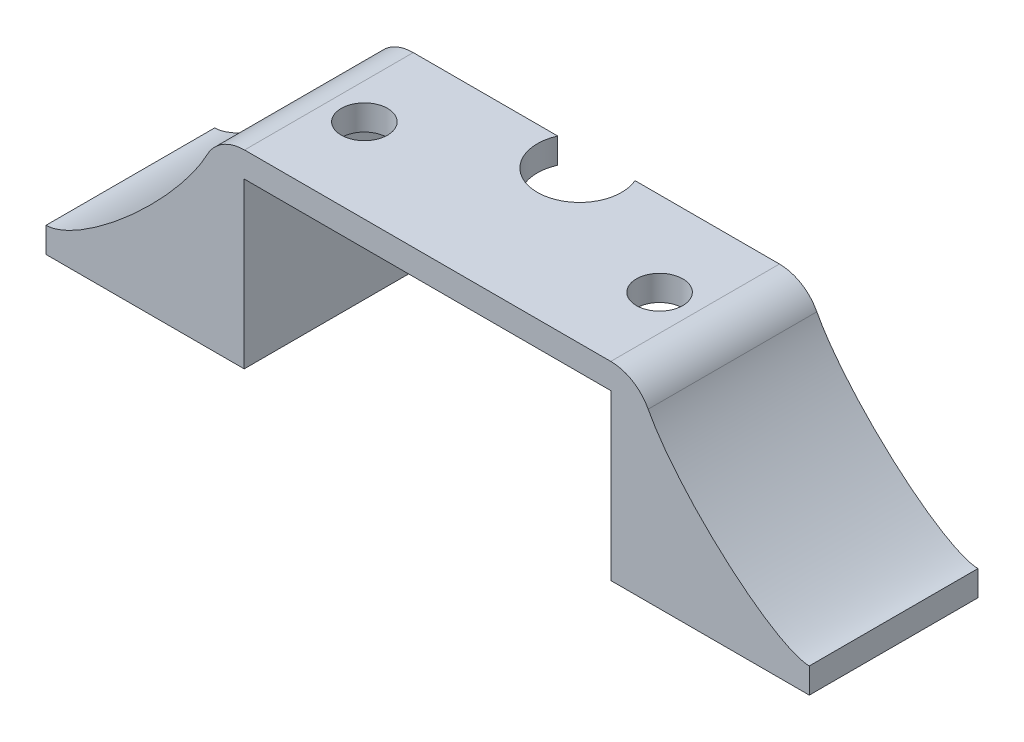
ISO-10303-21;
HEADER;
FILE_DESCRIPTION(('STEP AP214'),'2;1');
FILE_NAME('part.step','',(''),(''),'','','');
FILE_SCHEMA(('AUTOMOTIVE_DESIGN { 1 0 10303 214 1 1 1 1 }'));
ENDSEC;
DATA;
#1=APPLICATION_CONTEXT('core data for automotive mechanical design processes');
#2=APPLICATION_PROTOCOL_DEFINITION('international standard','automotive_design',2000,#1);
#3=PRODUCT_CONTEXT('',#1,'mechanical');
#4=PRODUCT('Part','Part','',(#3));
#5=PRODUCT_RELATED_PRODUCT_CATEGORY('part','',(#4));
#6=PRODUCT_DEFINITION_FORMATION('','',#4);
#7=PRODUCT_DEFINITION_CONTEXT('part definition',#1,'design');
#8=PRODUCT_DEFINITION('design','',#6,#7);
#9=PRODUCT_DEFINITION_SHAPE('','',#8);
#10=(LENGTH_UNIT() NAMED_UNIT(*) SI_UNIT(.MILLI.,.METRE.));
#11=(NAMED_UNIT(*) PLANE_ANGLE_UNIT() SI_UNIT($,.RADIAN.));
#12=(NAMED_UNIT(*) SI_UNIT($,.STERADIAN.) SOLID_ANGLE_UNIT());
#13=UNCERTAINTY_MEASURE_WITH_UNIT(LENGTH_MEASURE(1.E-05),#10,'distance_accuracy_value','');
#14=(GEOMETRIC_REPRESENTATION_CONTEXT(3) GLOBAL_UNCERTAINTY_ASSIGNED_CONTEXT((#13)) GLOBAL_UNIT_ASSIGNED_CONTEXT((#10,
#11,#12)) REPRESENTATION_CONTEXT('',''));
#15=CARTESIAN_POINT('',(0.,0.,0.));
#16=DIRECTION('',(0.,0.,1.));
#17=DIRECTION('',(1.,0.,0.));
#18=AXIS2_PLACEMENT_3D('',#15,#16,#17);
#19=CARTESIAN_POINT('',(0.,0.,0.));
#20=DIRECTION('',(0.,-1.,0.));
#21=DIRECTION('',(0.,0.,-1.));
#22=AXIS2_PLACEMENT_3D('',#19,#20,#21);
#23=PLANE('',#22);
#24=CARTESIAN_POINT('',(-17.5,0.,0.));
#25=DIRECTION('',(0.,-1.,0.));
#26=DIRECTION('',(0.,0.,-1.));
#27=AXIS2_PLACEMENT_3D('',#24,#25,#26);
#28=CIRCLE('',#27,2.75);
#29=CARTESIAN_POINT('',(-17.5,0.,2.75));
#30=VERTEX_POINT('',#29);
#31=EDGE_CURVE('E396',#30,#30,#28,.F.);
#32=ORIENTED_EDGE('',*,*,#31,.T.);
#33=EDGE_LOOP('',(#32));
#34=FACE_BOUND('',#33,.T.);
#35=CARTESIAN_POINT('',(17.5,0.,0.));
#36=DIRECTION('',(0.,-1.,0.));
#37=DIRECTION('',(0.,0.,-1.));
#38=AXIS2_PLACEMENT_3D('',#35,#36,#37);
#39=CIRCLE('',#38,2.75);
#40=CARTESIAN_POINT('',(17.5,0.,2.75));
#41=VERTEX_POINT('',#40);
#42=EDGE_CURVE('E397',#41,#41,#39,.F.);
#43=ORIENTED_EDGE('',*,*,#42,.T.);
#44=EDGE_LOOP('',(#43));
#45=FACE_BOUND('',#44,.T.);
#46=DIRECTION('',(-1.,0.,0.));
#47=VECTOR('',#46,1.);
#48=CARTESIAN_POINT('',(25.25,0.,-10.));
#49=LINE('',#48,#47);
#50=CARTESIAN_POINT('',(21.75,0.,-10.));
#51=VERTEX_POINT('',#50);
#52=CARTESIAN_POINT('',(4.58257569495584,0.,-10.));
#53=VERTEX_POINT('',#52);
#54=EDGE_CURVE('E344',#51,#53,#49,.T.);
#55=ORIENTED_EDGE('',*,*,#54,.F.);
#56=DIRECTION('',(0.,0.,-1.));
#57=VECTOR('',#56,1.);
#58=CARTESIAN_POINT('',(21.75,0.,10.));
#59=LINE('',#58,#57);
#60=CARTESIAN_POINT('',(21.75,0.,10.));
#61=VERTEX_POINT('',#60);
#62=EDGE_CURVE('E428',#61,#51,#59,.T.);
#63=ORIENTED_EDGE('',*,*,#62,.F.);
#64=DIRECTION('',(1.,0.,0.));
#65=VECTOR('',#64,1.);
#66=CARTESIAN_POINT('',(25.25,0.,10.));
#67=LINE('',#66,#65);
#68=CARTESIAN_POINT('',(-21.75,0.,10.));
#69=VERTEX_POINT('',#68);
#70=EDGE_CURVE('E339',#69,#61,#67,.T.);
#71=ORIENTED_EDGE('',*,*,#70,.F.);
#72=DIRECTION('',(0.,0.,1.));
#73=VECTOR('',#72,1.);
#74=CARTESIAN_POINT('',(-21.75,0.,10.));
#75=LINE('',#74,#73);
#76=CARTESIAN_POINT('',(-21.75,0.,-10.));
#77=VERTEX_POINT('',#76);
#78=EDGE_CURVE('E415',#77,#69,#75,.T.);
#79=ORIENTED_EDGE('',*,*,#78,.F.);
#80=CARTESIAN_POINT('',(-4.58257569495584,0.,-10.));
#81=VERTEX_POINT('',#80);
#82=EDGE_CURVE('E343',#81,#77,#49,.T.);
#83=ORIENTED_EDGE('',*,*,#82,.F.);
#84=CARTESIAN_POINT('',(0.,0.,-8.));
#85=DIRECTION('',(0.,-1.,0.));
#86=DIRECTION('',(0.,0.,-1.));
#87=AXIS2_PLACEMENT_3D('',#84,#85,#86);
#88=CIRCLE('',#87,5.);
#89=EDGE_CURVE('E389',#81,#53,#88,.F.);
#90=ORIENTED_EDGE('',*,*,#89,.T.);
#91=EDGE_LOOP('',(#55,#63,#71,#79,#83,#90));
#92=FACE_BOUND('',#91,.T.);
#93=ADVANCED_FACE('F41',(#34,#45,#92),#23,.T.);
#94=CARTESIAN_POINT('',(25.25,3.,-10.));
#95=DIRECTION('',(0.,0.,1.));
#96=DIRECTION('',(1.,0.,0.));
#97=AXIS2_PLACEMENT_3D('',#94,#95,#96);
#98=PLANE('',#97);
#99=DIRECTION('',(-1.,0.,0.));
#100=VECTOR('',#99,1.);
#101=CARTESIAN_POINT('',(25.25,3.,-10.));
#102=LINE('',#101,#100);
#103=CARTESIAN_POINT('',(21.709537079792,3.,-10.));
#104=VERTEX_POINT('',#103);
#105=CARTESIAN_POINT('',(4.58257569495584,3.,-10.));
#106=VERTEX_POINT('',#105);
#107=EDGE_CURVE('E154',#104,#106,#102,.T.);
#108=ORIENTED_EDGE('',*,*,#107,.F.);
#109=CARTESIAN_POINT('',(21.709537079792,-2.,-10.));
#110=DIRECTION('',(0.,0.,1.));
#111=DIRECTION('',(1.,0.,0.));
#112=AXIS2_PLACEMENT_3D('',#109,#110,#111);
#113=CIRCLE('',#112,5.);
#114=CARTESIAN_POINT('',(26.1431729290285,0.310662738501674,-10.));
#115=VERTEX_POINT('',#114);
#116=EDGE_CURVE('E50',#104,#115,#113,.F.);
#117=ORIENTED_EDGE('',*,*,#116,.T.);
#118=CARTESIAN_POINT('',(45.2437490231322,-16.5,-10.));
#119=CARTESIAN_POINT('',(25.7376524151983,-16.5,-10.));
#120=CARTESIAN_POINT('',(25.25,3.,-10.));
#121=(BOUNDED_CURVE() B_SPLINE_CURVE(2,(#118,#119,#120),.UNSPECIFIED.,.F.,
.F.) B_SPLINE_CURVE_WITH_KNOTS((3,3),(0.,1.),
.UNSPECIFIED.) CURVE() GEOMETRIC_REPRESENTATION_ITEM() RATIONAL_B_SPLINE_CURVE((1.,0.25,1.)) REPRESENTATION_ITEM(''));
#122=CARTESIAN_POINT('',(45.2468745115661,-16.5,-10.));
#123=VERTEX_POINT('',#122);
#124=EDGE_CURVE('E235',#115,#123,#121,.F.);
#125=ORIENTED_EDGE('',*,*,#124,.T.);
#126=DIRECTION('',(0.,1.,0.));
#127=VECTOR('',#126,1.);
#128=CARTESIAN_POINT('',(45.25,-19.5,-10.));
#129=LINE('',#128,#127);
#130=CARTESIAN_POINT('',(45.25,-19.5,-10.));
#131=VERTEX_POINT('',#130);
#132=EDGE_CURVE('E356',#131,#123,#129,.T.);
#133=ORIENTED_EDGE('',*,*,#132,.F.);
#134=DIRECTION('',(1.,0.,0.));
#135=VECTOR('',#134,1.);
#136=CARTESIAN_POINT('',(25.25,-19.5,-10.));
#137=LINE('',#136,#135);
#138=CARTESIAN_POINT('',(21.75,-19.5,-10.));
#139=VERTEX_POINT('',#138);
#140=EDGE_CURVE('E427',#139,#131,#137,.T.);
#141=ORIENTED_EDGE('',*,*,#140,.F.);
#142=DIRECTION('',(0.,1.,0.));
#143=VECTOR('',#142,1.);
#144=CARTESIAN_POINT('',(21.75,-19.5,-10.));
#145=LINE('',#144,#143);
#146=EDGE_CURVE('E425',#139,#51,#145,.T.);
#147=ORIENTED_EDGE('',*,*,#146,.T.);
#148=ORIENTED_EDGE('',*,*,#54,.T.);
#149=DIRECTION('',(0.,1.,0.));
#150=VECTOR('',#149,1.);
#151=CARTESIAN_POINT('',(4.58257569495584,-14.142135623731,-10.));
#152=LINE('',#151,#150);
#153=EDGE_CURVE('E337',#53,#106,#152,.T.);
#154=ORIENTED_EDGE('',*,*,#153,.T.);
#155=EDGE_LOOP('',(#108,#117,#125,#133,#141,#147,#148,#154));
#156=FACE_BOUND('',#155,.T.);
#157=ADVANCED_FACE('F312',(#156),#98,.F.);
#158=CARTESIAN_POINT('',(25.25,3.,10.));
#159=DIRECTION('',(0.,0.,-1.));
#160=DIRECTION('',(-1.,0.,0.));
#161=AXIS2_PLACEMENT_3D('',#158,#159,#160);
#162=PLANE('',#161);
#163=DIRECTION('',(1.,0.,0.));
#164=VECTOR('',#163,1.);
#165=CARTESIAN_POINT('',(25.25,3.,10.));
#166=LINE('',#165,#164);
#167=CARTESIAN_POINT('',(-21.709537079792,3.,10.));
#168=VERTEX_POINT('',#167);
#169=CARTESIAN_POINT('',(21.709537079792,3.,10.));
#170=VERTEX_POINT('',#169);
#171=EDGE_CURVE('E332',#168,#170,#166,.T.);
#172=ORIENTED_EDGE('',*,*,#171,.F.);
#173=CARTESIAN_POINT('',(-21.709537079792,-2.,10.));
#174=DIRECTION('',(0.,0.,-1.));
#175=DIRECTION('',(-1.,0.,0.));
#176=AXIS2_PLACEMENT_3D('',#173,#174,#175);
#177=CIRCLE('',#176,5.);
#178=CARTESIAN_POINT('',(-26.1431729290285,0.310662738501675,10.));
#179=VERTEX_POINT('',#178);
#180=EDGE_CURVE('E150',#168,#179,#177,.F.);
#181=ORIENTED_EDGE('',*,*,#180,.T.);
#182=CARTESIAN_POINT('',(-45.2437490231322,-16.5,10.));
#183=CARTESIAN_POINT('',(-25.7376524151984,-16.5,10.));
#184=CARTESIAN_POINT('',(-25.25,3.,10.));
#185=(BOUNDED_CURVE() B_SPLINE_CURVE(2,(#182,#183,#184),.UNSPECIFIED.,.F.,
.F.) B_SPLINE_CURVE_WITH_KNOTS((3,3),(0.,1.),
.UNSPECIFIED.) CURVE() GEOMETRIC_REPRESENTATION_ITEM() RATIONAL_B_SPLINE_CURVE((1.,0.25,1.)) REPRESENTATION_ITEM(''));
#186=CARTESIAN_POINT('',(-45.2468745115661,-16.5,10.));
#187=VERTEX_POINT('',#186);
#188=EDGE_CURVE('E142',#179,#187,#185,.F.);
#189=ORIENTED_EDGE('',*,*,#188,.T.);
#190=DIRECTION('',(0.,-1.,0.));
#191=VECTOR('',#190,1.);
#192=CARTESIAN_POINT('',(-45.25,-19.5,10.));
#193=LINE('',#192,#191);
#194=CARTESIAN_POINT('',(-45.25,-19.5,10.));
#195=VERTEX_POINT('',#194);
#196=EDGE_CURVE('E148',#187,#195,#193,.T.);
#197=ORIENTED_EDGE('',*,*,#196,.T.);
#198=DIRECTION('',(-1.,0.,0.));
#199=VECTOR('',#198,1.);
#200=CARTESIAN_POINT('',(-25.25,-19.5,10.));
#201=LINE('',#200,#199);
#202=CARTESIAN_POINT('',(-21.75,-19.5,10.));
#203=VERTEX_POINT('',#202);
#204=EDGE_CURVE('E414',#203,#195,#201,.T.);
#205=ORIENTED_EDGE('',*,*,#204,.F.);
#206=DIRECTION('',(0.,1.,0.));
#207=VECTOR('',#206,1.);
#208=CARTESIAN_POINT('',(-21.75,-19.5,10.));
#209=LINE('',#208,#207);
#210=EDGE_CURVE('E411',#203,#69,#209,.T.);
#211=ORIENTED_EDGE('',*,*,#210,.T.);
#212=ORIENTED_EDGE('',*,*,#70,.T.);
#213=DIRECTION('',(0.,1.,0.));
#214=VECTOR('',#213,1.);
#215=CARTESIAN_POINT('',(21.75,-19.5,10.));
#216=LINE('',#215,#214);
#217=CARTESIAN_POINT('',(21.75,-19.5,10.));
#218=VERTEX_POINT('',#217);
#219=EDGE_CURVE('E419',#218,#61,#216,.T.);
#220=ORIENTED_EDGE('',*,*,#219,.F.);
#221=DIRECTION('',(-1.,0.,0.));
#222=VECTOR('',#221,1.);
#223=CARTESIAN_POINT('',(25.25,-19.5,10.));
#224=LINE('',#223,#222);
#225=CARTESIAN_POINT('',(45.25,-19.5,10.));
#226=VERTEX_POINT('',#225);
#227=EDGE_CURVE('E431',#226,#218,#224,.T.);
#228=ORIENTED_EDGE('',*,*,#227,.F.);
#229=DIRECTION('',(0.,-1.,0.));
#230=VECTOR('',#229,1.);
#231=CARTESIAN_POINT('',(45.25,-19.5,10.));
#232=LINE('',#231,#230);
#233=CARTESIAN_POINT('',(45.2468745115661,-16.5,9.99999999999999));
#234=VERTEX_POINT('',#233);
#235=EDGE_CURVE('E351',#234,#226,#232,.T.);
#236=ORIENTED_EDGE('',*,*,#235,.F.);
#237=CARTESIAN_POINT('',(25.25,3.,10.));
#238=CARTESIAN_POINT('',(25.7376524151983,-16.5,10.));
#239=CARTESIAN_POINT('',(45.2437490231322,-16.5,10.));
#240=(BOUNDED_CURVE() B_SPLINE_CURVE(2,(#237,#238,#239),.UNSPECIFIED.,.F.,
.F.) B_SPLINE_CURVE_WITH_KNOTS((3,3),(0.,1.),
.UNSPECIFIED.) CURVE() GEOMETRIC_REPRESENTATION_ITEM() RATIONAL_B_SPLINE_CURVE((1.,0.25,1.)) REPRESENTATION_ITEM(''));
#241=CARTESIAN_POINT('',(26.1431834538004,0.31066759500854,10.));
#242=VERTEX_POINT('',#241);
#243=EDGE_CURVE('E380',#234,#242,#240,.F.);
#244=ORIENTED_EDGE('',*,*,#243,.T.);
#245=CARTESIAN_POINT('',(21.709537079792,-2.,10.));
#246=DIRECTION('',(0.,0.,-1.));
#247=DIRECTION('',(-1.,0.,0.));
#248=AXIS2_PLACEMENT_3D('',#245,#246,#247);
#249=CIRCLE('',#248,5.);
#250=EDGE_CURVE('E218',#242,#170,#249,.F.);
#251=ORIENTED_EDGE('',*,*,#250,.T.);
#252=EDGE_LOOP('',(#172,#181,#189,#197,#205,#211,#212,#220,#228,#236,#244,#251));
#253=FACE_BOUND('',#252,.T.);
#254=ADVANCED_FACE('F146',(#253),#162,.F.);
#255=CARTESIAN_POINT('',(-25.25,3.,-10.));
#256=CARTESIAN_POINT('',(-25.7376524151984,-16.5,-10.));
#257=CARTESIAN_POINT('',(-45.2437490231322,-16.5,-10.));
#258=(BOUNDED_CURVE() B_SPLINE_CURVE(2,(#255,#256,#257),.UNSPECIFIED.,.F.,
.F.) B_SPLINE_CURVE_WITH_KNOTS((3,3),(0.,1.),
.UNSPECIFIED.) CURVE() GEOMETRIC_REPRESENTATION_ITEM() RATIONAL_B_SPLINE_CURVE((1.,0.25,1.)) REPRESENTATION_ITEM(''));
#259=CARTESIAN_POINT('',(-45.2468745115661,-16.5,-10.));
#260=VERTEX_POINT('',#259);
#261=CARTESIAN_POINT('',(-26.1431834538004,0.310667595008533,-10.));
#262=VERTEX_POINT('',#261);
#263=EDGE_CURVE('E153',#260,#262,#258,.F.);
#264=ORIENTED_EDGE('',*,*,#263,.T.);
#265=CARTESIAN_POINT('',(-21.709537079792,-2.,-10.));
#266=DIRECTION('',(0.,0.,1.));
#267=DIRECTION('',(1.,0.,0.));
#268=AXIS2_PLACEMENT_3D('',#265,#266,#267);
#269=CIRCLE('',#268,5.);
#270=CARTESIAN_POINT('',(-21.709537079792,3.,-10.));
#271=VERTEX_POINT('',#270);
#272=EDGE_CURVE('E227',#262,#271,#269,.F.);
#273=ORIENTED_EDGE('',*,*,#272,.T.);
#274=CARTESIAN_POINT('',(-4.58257569495584,3.,-10.));
#275=VERTEX_POINT('',#274);
#276=EDGE_CURVE('E324',#275,#271,#102,.T.);
#277=ORIENTED_EDGE('',*,*,#276,.F.);
#278=DIRECTION('',(0.,1.,0.));
#279=VECTOR('',#278,1.);
#280=CARTESIAN_POINT('',(-4.58257569495584,-14.142135623731,-10.));
#281=LINE('',#280,#279);
#282=EDGE_CURVE('E387',#275,#81,#281,.F.);
#283=ORIENTED_EDGE('',*,*,#282,.T.);
#284=ORIENTED_EDGE('',*,*,#82,.T.);
#285=DIRECTION('',(0.,1.,0.));
#286=VECTOR('',#285,1.);
#287=CARTESIAN_POINT('',(-21.75,-19.5,-10.));
#288=LINE('',#287,#286);
#289=CARTESIAN_POINT('',(-21.75,-19.5,-10.));
#290=VERTEX_POINT('',#289);
#291=EDGE_CURVE('E404',#290,#77,#288,.T.);
#292=ORIENTED_EDGE('',*,*,#291,.F.);
#293=DIRECTION('',(1.,0.,0.));
#294=VECTOR('',#293,1.);
#295=CARTESIAN_POINT('',(-25.25,-19.5,-10.));
#296=LINE('',#295,#294);
#297=CARTESIAN_POINT('',(-45.25,-19.5,-10.));
#298=VERTEX_POINT('',#297);
#299=EDGE_CURVE('E418',#298,#290,#296,.T.);
#300=ORIENTED_EDGE('',*,*,#299,.F.);
#301=DIRECTION('',(0.,1.,0.));
#302=VECTOR('',#301,1.);
#303=CARTESIAN_POINT('',(-45.25,-19.5,-10.));
#304=LINE('',#303,#302);
#305=EDGE_CURVE('E169',#298,#260,#304,.T.);
#306=ORIENTED_EDGE('',*,*,#305,.T.);
#307=EDGE_LOOP('',(#264,#273,#277,#283,#284,#292,#300,#306));
#308=FACE_BOUND('',#307,.T.);
#309=ADVANCED_FACE('F309',(#308),#98,.F.);
#310=CARTESIAN_POINT('',(0.,3.,0.));
#311=DIRECTION('',(0.,-1.,0.));
#312=DIRECTION('',(0.,0.,-1.));
#313=AXIS2_PLACEMENT_3D('',#310,#311,#312);
#314=PLANE('',#313);
#315=CARTESIAN_POINT('',(-17.5,3.,0.));
#316=DIRECTION('',(0.,1.,0.));
#317=DIRECTION('',(0.,0.,1.));
#318=AXIS2_PLACEMENT_3D('',#315,#316,#317);
#319=CIRCLE('',#318,2.75);
#320=CARTESIAN_POINT('',(-17.5,3.,2.75));
#321=VERTEX_POINT('',#320);
#322=EDGE_CURVE('E400',#321,#321,#319,.T.);
#323=ORIENTED_EDGE('',*,*,#322,.F.);
#324=EDGE_LOOP('',(#323));
#325=FACE_BOUND('',#324,.T.);
#326=CARTESIAN_POINT('',(17.5,3.,0.));
#327=DIRECTION('',(0.,1.,0.));
#328=DIRECTION('',(0.,0.,-1.));
#329=AXIS2_PLACEMENT_3D('',#326,#327,#328);
#330=CIRCLE('',#329,2.75);
#331=CARTESIAN_POINT('',(17.5,3.,2.75));
#332=VERTEX_POINT('',#331);
#333=EDGE_CURVE('E401',#332,#332,#330,.T.);
#334=ORIENTED_EDGE('',*,*,#333,.F.);
#335=EDGE_LOOP('',(#334));
#336=FACE_BOUND('',#335,.T.);
#337=ORIENTED_EDGE('',*,*,#276,.T.);
#338=DIRECTION('',(0.,0.,1.));
#339=VECTOR('',#338,1.);
#340=CARTESIAN_POINT('',(-21.709537079792,3.,0.));
#341=LINE('',#340,#339);
#342=EDGE_CURVE('E220',#271,#168,#341,.T.);
#343=ORIENTED_EDGE('',*,*,#342,.T.);
#344=ORIENTED_EDGE('',*,*,#171,.T.);
#345=DIRECTION('',(0.,0.,-1.));
#346=VECTOR('',#345,1.);
#347=CARTESIAN_POINT('',(21.709537079792,3.,0.));
#348=LINE('',#347,#346);
#349=EDGE_CURVE('E369',#170,#104,#348,.T.);
#350=ORIENTED_EDGE('',*,*,#349,.T.);
#351=ORIENTED_EDGE('',*,*,#107,.T.);
#352=CARTESIAN_POINT('',(0.,3.,-8.));
#353=DIRECTION('',(0.,1.,0.));
#354=DIRECTION('',(0.,0.,1.));
#355=AXIS2_PLACEMENT_3D('',#352,#353,#354);
#356=CIRCLE('',#355,5.);
#357=EDGE_CURVE('E392',#275,#106,#356,.T.);
#358=ORIENTED_EDGE('',*,*,#357,.F.);
#359=EDGE_LOOP('',(#337,#343,#344,#350,#351,#358));
#360=FACE_BOUND('',#359,.T.);
#361=ADVANCED_FACE('F305',(#325,#336,#360),#314,.F.);
#362=CARTESIAN_POINT('',(0.,-14.142135623731,-8.));
#363=DIRECTION('',(0.,1.,0.));
#364=DIRECTION('',(0.,0.,1.));
#365=AXIS2_PLACEMENT_3D('',#362,#363,#364);
#366=CYLINDRICAL_SURFACE('',#365,5.);
#367=ORIENTED_EDGE('',*,*,#89,.F.);
#368=ORIENTED_EDGE('',*,*,#282,.F.);
#369=ORIENTED_EDGE('',*,*,#357,.T.);
#370=ORIENTED_EDGE('',*,*,#153,.F.);
#371=EDGE_LOOP('',(#367,#368,#369,#370));
#372=FACE_BOUND('',#371,.T.);
#373=ADVANCED_FACE('F301',(#372),#366,.F.);
#374=CARTESIAN_POINT('',(17.5,-7.77817459305202,0.));
#375=DIRECTION('',(0.,1.,0.));
#376=DIRECTION('',(0.,0.,1.));
#377=AXIS2_PLACEMENT_3D('',#374,#375,#376);
#378=CYLINDRICAL_SURFACE('',#377,2.75);
#379=CARTESIAN_POINT('',(17.5,3.,2.75));
#380=CARTESIAN_POINT('',(17.5,2.96875,2.75));
#381=CARTESIAN_POINT('',(17.5,2.9375,2.75));
#382=CARTESIAN_POINT('',(17.5,2.875,2.75));
#383=CARTESIAN_POINT('',(17.5,2.84375,2.75));
#384=CARTESIAN_POINT('',(17.5,2.78125,2.75));
#385=CARTESIAN_POINT('',(17.5,2.75,2.75));
#386=CARTESIAN_POINT('',(17.5,2.6875,2.75));
#387=CARTESIAN_POINT('',(17.5,2.65625,2.75));
#388=CARTESIAN_POINT('',(17.5,2.59375,2.75));
#389=CARTESIAN_POINT('',(17.5,2.5625,2.75));
#390=CARTESIAN_POINT('',(17.5,2.5,2.75));
#391=CARTESIAN_POINT('',(17.5,2.46875,2.75));
#392=CARTESIAN_POINT('',(17.5,2.40625,2.75));
#393=CARTESIAN_POINT('',(17.5,2.375,2.75));
#394=CARTESIAN_POINT('',(17.5,2.3125,2.75));
#395=CARTESIAN_POINT('',(17.5,2.28125,2.75));
#396=CARTESIAN_POINT('',(17.5,2.21875,2.75));
#397=CARTESIAN_POINT('',(17.5,2.1875,2.75));
#398=CARTESIAN_POINT('',(17.5,2.125,2.75));
#399=CARTESIAN_POINT('',(17.5,2.09375,2.75));
#400=CARTESIAN_POINT('',(17.5,2.03125,2.75));
#401=CARTESIAN_POINT('',(17.5,2.,2.75));
#402=CARTESIAN_POINT('',(17.5,1.9375,2.75));
#403=CARTESIAN_POINT('',(17.5,1.90625,2.75));
#404=CARTESIAN_POINT('',(17.5,1.84375,2.75));
#405=CARTESIAN_POINT('',(17.5,1.8125,2.75));
#406=CARTESIAN_POINT('',(17.5,1.75,2.75));
#407=CARTESIAN_POINT('',(17.5,1.71875,2.75));
#408=CARTESIAN_POINT('',(17.5,1.65625,2.75));
#409=CARTESIAN_POINT('',(17.5,1.625,2.75));
#410=CARTESIAN_POINT('',(17.5,1.5625,2.75));
#411=CARTESIAN_POINT('',(17.5,1.53125,2.75));
#412=CARTESIAN_POINT('',(17.5,1.46875,2.75));
#413=CARTESIAN_POINT('',(17.5,1.4375,2.75));
#414=CARTESIAN_POINT('',(17.5,1.375,2.75));
#415=CARTESIAN_POINT('',(17.5,1.34375,2.75));
#416=CARTESIAN_POINT('',(17.5,1.28125,2.75));
#417=CARTESIAN_POINT('',(17.5,1.25,2.75));
#418=CARTESIAN_POINT('',(17.5,1.1875,2.75));
#419=CARTESIAN_POINT('',(17.5,1.15625,2.75));
#420=CARTESIAN_POINT('',(17.5,1.09375,2.75));
#421=CARTESIAN_POINT('',(17.5,1.0625,2.75));
#422=CARTESIAN_POINT('',(17.5,0.999999999999999,2.75));
#423=CARTESIAN_POINT('',(17.5,0.968749999999999,2.75));
#424=CARTESIAN_POINT('',(17.5,0.90625,2.75));
#425=CARTESIAN_POINT('',(17.5,0.875,2.75));
#426=CARTESIAN_POINT('',(17.5,0.8125,2.75));
#427=CARTESIAN_POINT('',(17.5,0.78125,2.75));
#428=CARTESIAN_POINT('',(17.5,0.71875,2.75));
#429=CARTESIAN_POINT('',(17.5,0.6875,2.75));
#430=CARTESIAN_POINT('',(17.5,0.625,2.75));
#431=CARTESIAN_POINT('',(17.5,0.59375,2.75));
#432=CARTESIAN_POINT('',(17.5,0.53125,2.75));
#433=CARTESIAN_POINT('',(17.5,0.5,2.75));
#434=CARTESIAN_POINT('',(17.5,0.4375,2.75));
#435=CARTESIAN_POINT('',(17.5,0.40625,2.75));
#436=CARTESIAN_POINT('',(17.5,0.343749999999999,2.75));
#437=CARTESIAN_POINT('',(17.5,0.312499999999999,2.75));
#438=CARTESIAN_POINT('',(17.5,0.249999999999999,2.75));
#439=CARTESIAN_POINT('',(17.5,0.218749999999999,2.75));
#440=CARTESIAN_POINT('',(17.5,0.156249999999999,2.75));
#441=CARTESIAN_POINT('',(17.5,0.124999999999999,2.75));
#442=CARTESIAN_POINT('',(17.5,0.0624999999999995,2.75));
#443=CARTESIAN_POINT('',(17.5,0.0312499999999997,2.75));
#444=CARTESIAN_POINT('',(17.5,0.,2.75));
#445=B_SPLINE_CURVE_WITH_KNOTS('',3,(#379,#380,#381,#382,#383,#384,#385,#386,#387,#388,#389,
#390,#391,#392,#393,#394,#395,#396,#397,#398,#399,#400,#401,#402,#403,#404,#405,#406,#407,#408,
#409,#410,#411,#412,#413,#414,#415,#416,#417,#418,#419,#420,#421,#422,#423,#424,#425,#426,#427,
#428,#429,#430,#431,#432,#433,#434,#435,#436,#437,#438,#439,#440,#441,#442,#443,#444),
.UNSPECIFIED.,.F.,.F.,(4,2,2,2,2,2,2,2,2,2,2,2,2,2,2,2,2,2,2,2,2,2,2,2,2,2,2,2,2,2,2,2,4),(0.,
0.0937500000000001,0.1875,0.28125,0.375,0.46875,0.5625,0.656250000000001,0.750000000000001,
0.843749999999999,0.937499999999999,1.03125,1.125,1.21875,1.3125,1.40625,1.5,1.59375,1.6875,
1.78125,1.875,1.96875,2.0625,2.15625,2.25,2.34375,2.4375,2.53125,2.625,2.71875,2.8125,2.90625,
3.),.UNSPECIFIED.);
#446=EDGE_CURVE('BSEAM297',#332,#41,#445,.T.);
#447=ORIENTED_EDGE('',*,*,#333,.T.);
#448=ORIENTED_EDGE('',*,*,#42,.F.);
#449=ORIENTED_EDGE('',*,*,#446,.T.);
#450=ORIENTED_EDGE('',*,*,#446,.F.);
#451=EDGE_LOOP('',(#447,#449,#448,#450));
#452=FACE_BOUND('',#451,.T.);
#453=ADVANCED_FACE('F297',(#452),#378,.F.);
#454=CARTESIAN_POINT('',(-17.5,-7.77817459305202,0.));
#455=DIRECTION('',(0.,1.,0.));
#456=DIRECTION('',(0.,0.,1.));
#457=AXIS2_PLACEMENT_3D('',#454,#455,#456);
#458=CYLINDRICAL_SURFACE('',#457,2.75);
#459=CARTESIAN_POINT('',(-17.5,3.,2.75));
#460=CARTESIAN_POINT('',(-17.5,2.96875,2.75));
#461=CARTESIAN_POINT('',(-17.5,2.9375,2.75));
#462=CARTESIAN_POINT('',(-17.5,2.875,2.75));
#463=CARTESIAN_POINT('',(-17.5,2.84375,2.75));
#464=CARTESIAN_POINT('',(-17.5,2.78125,2.75));
#465=CARTESIAN_POINT('',(-17.5,2.75,2.75));
#466=CARTESIAN_POINT('',(-17.5,2.6875,2.75));
#467=CARTESIAN_POINT('',(-17.5,2.65625,2.75));
#468=CARTESIAN_POINT('',(-17.5,2.59375,2.75));
#469=CARTESIAN_POINT('',(-17.5,2.5625,2.75));
#470=CARTESIAN_POINT('',(-17.5,2.5,2.75));
#471=CARTESIAN_POINT('',(-17.5,2.46875,2.75));
#472=CARTESIAN_POINT('',(-17.5,2.40625,2.75));
#473=CARTESIAN_POINT('',(-17.5,2.375,2.75));
#474=CARTESIAN_POINT('',(-17.5,2.3125,2.75));
#475=CARTESIAN_POINT('',(-17.5,2.28125,2.75));
#476=CARTESIAN_POINT('',(-17.5,2.21875,2.75));
#477=CARTESIAN_POINT('',(-17.5,2.1875,2.75));
#478=CARTESIAN_POINT('',(-17.5,2.125,2.75));
#479=CARTESIAN_POINT('',(-17.5,2.09375,2.75));
#480=CARTESIAN_POINT('',(-17.5,2.03125,2.75));
#481=CARTESIAN_POINT('',(-17.5,2.,2.75));
#482=CARTESIAN_POINT('',(-17.5,1.9375,2.75));
#483=CARTESIAN_POINT('',(-17.5,1.90625,2.75));
#484=CARTESIAN_POINT('',(-17.5,1.84375,2.75));
#485=CARTESIAN_POINT('',(-17.5,1.8125,2.75));
#486=CARTESIAN_POINT('',(-17.5,1.75,2.75));
#487=CARTESIAN_POINT('',(-17.5,1.71875,2.75));
#488=CARTESIAN_POINT('',(-17.5,1.65625,2.75));
#489=CARTESIAN_POINT('',(-17.5,1.625,2.75));
#490=CARTESIAN_POINT('',(-17.5,1.5625,2.75));
#491=CARTESIAN_POINT('',(-17.5,1.53125,2.75));
#492=CARTESIAN_POINT('',(-17.5,1.46875,2.75));
#493=CARTESIAN_POINT('',(-17.5,1.4375,2.75));
#494=CARTESIAN_POINT('',(-17.5,1.375,2.75));
#495=CARTESIAN_POINT('',(-17.5,1.34375,2.75));
#496=CARTESIAN_POINT('',(-17.5,1.28125,2.75));
#497=CARTESIAN_POINT('',(-17.5,1.25,2.75));
#498=CARTESIAN_POINT('',(-17.5,1.1875,2.75));
#499=CARTESIAN_POINT('',(-17.5,1.15625,2.75));
#500=CARTESIAN_POINT('',(-17.5,1.09375,2.75));
#501=CARTESIAN_POINT('',(-17.5,1.0625,2.75));
#502=CARTESIAN_POINT('',(-17.5,0.999999999999999,2.75));
#503=CARTESIAN_POINT('',(-17.5,0.968749999999999,2.75));
#504=CARTESIAN_POINT('',(-17.5,0.90625,2.75));
#505=CARTESIAN_POINT('',(-17.5,0.875,2.75));
#506=CARTESIAN_POINT('',(-17.5,0.8125,2.75));
#507=CARTESIAN_POINT('',(-17.5,0.78125,2.75));
#508=CARTESIAN_POINT('',(-17.5,0.71875,2.75));
#509=CARTESIAN_POINT('',(-17.5,0.6875,2.75));
#510=CARTESIAN_POINT('',(-17.5,0.625,2.75));
#511=CARTESIAN_POINT('',(-17.5,0.59375,2.75));
#512=CARTESIAN_POINT('',(-17.5,0.53125,2.75));
#513=CARTESIAN_POINT('',(-17.5,0.5,2.75));
#514=CARTESIAN_POINT('',(-17.5,0.4375,2.75));
#515=CARTESIAN_POINT('',(-17.5,0.40625,2.75));
#516=CARTESIAN_POINT('',(-17.5,0.343749999999999,2.75));
#517=CARTESIAN_POINT('',(-17.5,0.312499999999999,2.75));
#518=CARTESIAN_POINT('',(-17.5,0.249999999999999,2.75));
#519=CARTESIAN_POINT('',(-17.5,0.218749999999999,2.75));
#520=CARTESIAN_POINT('',(-17.5,0.156249999999999,2.75));
#521=CARTESIAN_POINT('',(-17.5,0.124999999999999,2.75));
#522=CARTESIAN_POINT('',(-17.5,0.0624999999999995,2.75));
#523=CARTESIAN_POINT('',(-17.5,0.0312499999999997,2.75));
#524=CARTESIAN_POINT('',(-17.5,0.,2.75));
#525=B_SPLINE_CURVE_WITH_KNOTS('',3,(#459,#460,#461,#462,#463,#464,#465,#466,#467,#468,#469,
#470,#471,#472,#473,#474,#475,#476,#477,#478,#479,#480,#481,#482,#483,#484,#485,#486,#487,#488,
#489,#490,#491,#492,#493,#494,#495,#496,#497,#498,#499,#500,#501,#502,#503,#504,#505,#506,#507,
#508,#509,#510,#511,#512,#513,#514,#515,#516,#517,#518,#519,#520,#521,#522,#523,#524),
.UNSPECIFIED.,.F.,.F.,(4,2,2,2,2,2,2,2,2,2,2,2,2,2,2,2,2,2,2,2,2,2,2,2,2,2,2,2,2,2,2,2,4),(0.,
0.0937500000000001,0.1875,0.28125,0.375,0.46875,0.5625,0.656250000000001,0.750000000000001,
0.843749999999999,0.937499999999999,1.03125,1.125,1.21875,1.3125,1.40625,1.5,1.59375,1.6875,
1.78125,1.875,1.96875,2.0625,2.15625,2.25,2.34375,2.4375,2.53125,2.625,2.71875,2.8125,2.90625,
3.),.UNSPECIFIED.);
#526=EDGE_CURVE('BSEAM293',#321,#30,#525,.T.);
#527=ORIENTED_EDGE('',*,*,#322,.T.);
#528=ORIENTED_EDGE('',*,*,#31,.F.);
#529=ORIENTED_EDGE('',*,*,#526,.T.);
#530=ORIENTED_EDGE('',*,*,#526,.F.);
#531=EDGE_LOOP('',(#527,#529,#528,#530));
#532=FACE_BOUND('',#531,.T.);
#533=ADVANCED_FACE('F293',(#532),#458,.F.);
#534=CARTESIAN_POINT('',(-21.75,-19.5,10.));
#535=DIRECTION('',(-1.,0.,0.));
#536=DIRECTION('',(0.,0.,1.));
#537=AXIS2_PLACEMENT_3D('',#534,#535,#536);
#538=PLANE('',#537);
#539=ORIENTED_EDGE('',*,*,#78,.T.);
#540=ORIENTED_EDGE('',*,*,#210,.F.);
#541=DIRECTION('',(0.,0.,1.));
#542=VECTOR('',#541,1.);
#543=CARTESIAN_POINT('',(-21.75,-19.5,10.));
#544=LINE('',#543,#542);
#545=EDGE_CURVE('E421',#290,#203,#544,.T.);
#546=ORIENTED_EDGE('',*,*,#545,.F.);
#547=ORIENTED_EDGE('',*,*,#291,.T.);
#548=EDGE_LOOP('',(#539,#540,#546,#547));
#549=FACE_BOUND('',#548,.T.);
#550=ADVANCED_FACE('F289',(#549),#538,.F.);
#551=CARTESIAN_POINT('',(0.,-19.5,0.));
#552=DIRECTION('',(0.,-1.,0.));
#553=DIRECTION('',(0.,0.,-1.));
#554=AXIS2_PLACEMENT_3D('',#551,#552,#553);
#555=PLANE('',#554);
#556=ORIENTED_EDGE('',*,*,#204,.T.);
#557=DIRECTION('',(0.,0.,-1.));
#558=VECTOR('',#557,1.);
#559=CARTESIAN_POINT('',(-45.25,-19.5,10.));
#560=LINE('',#559,#558);
#561=EDGE_CURVE('E164',#195,#298,#560,.T.);
#562=ORIENTED_EDGE('',*,*,#561,.T.);
#563=ORIENTED_EDGE('',*,*,#299,.T.);
#564=ORIENTED_EDGE('',*,*,#545,.T.);
#565=EDGE_LOOP('',(#556,#562,#563,#564));
#566=FACE_BOUND('',#565,.T.);
#567=ADVANCED_FACE('F285',(#566),#555,.T.);
#568=CARTESIAN_POINT('',(21.75,-19.5,10.));
#569=DIRECTION('',(1.,0.,0.));
#570=DIRECTION('',(0.,0.,-1.));
#571=AXIS2_PLACEMENT_3D('',#568,#569,#570);
#572=PLANE('',#571);
#573=ORIENTED_EDGE('',*,*,#62,.T.);
#574=ORIENTED_EDGE('',*,*,#146,.F.);
#575=DIRECTION('',(0.,0.,-1.));
#576=VECTOR('',#575,1.);
#577=CARTESIAN_POINT('',(21.75,-19.5,10.));
#578=LINE('',#577,#576);
#579=EDGE_CURVE('E433',#218,#139,#578,.T.);
#580=ORIENTED_EDGE('',*,*,#579,.F.);
#581=ORIENTED_EDGE('',*,*,#219,.T.);
#582=EDGE_LOOP('',(#573,#574,#580,#581));
#583=FACE_BOUND('',#582,.T.);
#584=ADVANCED_FACE('F281',(#583),#572,.F.);
#585=CARTESIAN_POINT('',(0.,-19.5,0.));
#586=DIRECTION('',(0.,1.,0.));
#587=DIRECTION('',(0.,0.,1.));
#588=AXIS2_PLACEMENT_3D('',#585,#586,#587);
#589=PLANE('',#588);
#590=ORIENTED_EDGE('',*,*,#140,.T.);
#591=DIRECTION('',(0.,0.,-1.));
#592=VECTOR('',#591,1.);
#593=CARTESIAN_POINT('',(45.25,-19.5,10.));
#594=LINE('',#593,#592);
#595=EDGE_CURVE('E353',#226,#131,#594,.T.);
#596=ORIENTED_EDGE('',*,*,#595,.F.);
#597=ORIENTED_EDGE('',*,*,#227,.T.);
#598=ORIENTED_EDGE('',*,*,#579,.T.);
#599=EDGE_LOOP('',(#590,#596,#597,#598));
#600=FACE_BOUND('',#599,.T.);
#601=ADVANCED_FACE('F277',(#600),#589,.F.);
#602=CARTESIAN_POINT('',(45.25,0.,0.));
#603=DIRECTION('',(-1.,0.,0.));
#604=DIRECTION('',(0.,0.,1.));
#605=AXIS2_PLACEMENT_3D('',#602,#603,#604);
#606=PLANE('',#605);
#607=ORIENTED_EDGE('',*,*,#235,.T.);
#608=ORIENTED_EDGE('',*,*,#595,.T.);
#609=ORIENTED_EDGE('',*,*,#132,.T.);
#610=CARTESIAN_POINT('',(45.2437490231322,-16.5,11.));
#611=CARTESIAN_POINT('',(45.2437490231322,-16.5,3.66666666666667));
#612=CARTESIAN_POINT('',(45.2437490231322,-16.5,-3.66666666666667));
#613=CARTESIAN_POINT('',(45.2437490231322,-16.5,-11.));
#614=(BOUNDED_CURVE() B_SPLINE_CURVE(3,(#610,#611,#612,#613),.UNSPECIFIED.,.F.,
.F.) B_SPLINE_CURVE_WITH_KNOTS((4,4),(-0.001,0.021),
.UNSPECIFIED.) CURVE() GEOMETRIC_REPRESENTATION_ITEM() RATIONAL_B_SPLINE_CURVE((1.,1.,1.,1.)) REPRESENTATION_ITEM(''));
#615=EDGE_CURVE('E259',#123,#234,#614,.F.);
#616=ORIENTED_EDGE('',*,*,#615,.T.);
#617=EDGE_LOOP('',(#607,#608,#609,#616));
#618=FACE_BOUND('',#617,.T.);
#619=ADVANCED_FACE('F267',(#618),#606,.F.);
#620=CARTESIAN_POINT('',(-45.25,0.,0.));
#621=DIRECTION('',(1.,0.,0.));
#622=DIRECTION('',(0.,0.,1.));
#623=AXIS2_PLACEMENT_3D('',#620,#621,#622);
#624=PLANE('',#623);
#625=ORIENTED_EDGE('',*,*,#196,.F.);
#626=CARTESIAN_POINT('',(-45.2437490231322,-16.5,-11.));
#627=CARTESIAN_POINT('',(-45.2437490231322,-16.5,-3.66666666666668));
#628=CARTESIAN_POINT('',(-45.2437490231322,-16.5,3.66666666666668));
#629=CARTESIAN_POINT('',(-45.2437490231322,-16.5,11.));
#630=(BOUNDED_CURVE() B_SPLINE_CURVE(3,(#626,#627,#628,#629),.UNSPECIFIED.,.F.,
.F.) B_SPLINE_CURVE_WITH_KNOTS((4,4),(-0.001,0.021),
.UNSPECIFIED.) CURVE() GEOMETRIC_REPRESENTATION_ITEM() RATIONAL_B_SPLINE_CURVE((1.,1.,1.,1.)) REPRESENTATION_ITEM(''));
#631=EDGE_CURVE('E160',#260,#187,#630,.T.);
#632=ORIENTED_EDGE('',*,*,#631,.F.);
#633=ORIENTED_EDGE('',*,*,#305,.F.);
#634=ORIENTED_EDGE('',*,*,#561,.F.);
#635=EDGE_LOOP('',(#625,#632,#633,#634));
#636=FACE_BOUND('',#635,.T.);
#637=ADVANCED_FACE('F158',(#636),#624,.F.);
#638=CARTESIAN_POINT('',(-25.25,3.,-11.));
#639=CARTESIAN_POINT('',(-25.25,3.,-3.66666666666668));
#640=CARTESIAN_POINT('',(-25.25,3.,3.66666666666668));
#641=CARTESIAN_POINT('',(-25.25,3.,11.));
#642=CARTESIAN_POINT('',(-25.7376524151984,-16.5,-11.));
#643=CARTESIAN_POINT('',(-25.7376524151984,-16.5,-3.66666666666668));
#644=CARTESIAN_POINT('',(-25.7376524151984,-16.5,3.66666666666668));
#645=CARTESIAN_POINT('',(-25.7376524151984,-16.5,11.));
#646=CARTESIAN_POINT('',(-45.2437490231322,-16.5,-11.));
#647=CARTESIAN_POINT('',(-45.2437490231322,-16.5,-3.66666666666668));
#648=CARTESIAN_POINT('',(-45.2437490231322,-16.5,3.66666666666668));
#649=CARTESIAN_POINT('',(-45.2437490231322,-16.5,11.));
#650=(BOUNDED_SURFACE() B_SPLINE_SURFACE(2,3,((#638,#639,#640,#641),(#642,#643,#644,#645),(#646,
#647,#648,#649)),.UNSPECIFIED.,.F.,.F.,.F.) B_SPLINE_SURFACE_WITH_KNOTS((3,3),(4,4),(0.,1.),
(-0.001,0.021),.UNSPECIFIED.) GEOMETRIC_REPRESENTATION_ITEM() RATIONAL_B_SPLINE_SURFACE(((1.,1.,
1.,1.),(0.25,0.25,0.25,0.25),(1.,1.,1.,1.))) REPRESENTATION_ITEM('') SURFACE());
#651=DIRECTION('',(0.,0.,1.));
#652=VECTOR('',#651,1.);
#653=CARTESIAN_POINT('',(-26.1435014361578,0.31083536550709,10.));
#654=LINE('',#653,#652);
#655=EDGE_CURVE('E64',#179,#262,#654,.F.);
#656=CARTESIAN_POINT('',(-25.25,3.,-11.));
#657=CARTESIAN_POINT('',(-25.25,3.,-3.66666666666668));
#658=CARTESIAN_POINT('',(-25.25,3.,3.66666666666668));
#659=CARTESIAN_POINT('',(-25.25,3.,11.));
#660=CARTESIAN_POINT('',(-25.7376524151984,-16.5,-11.));
#661=CARTESIAN_POINT('',(-25.7376524151984,-16.5,-3.66666666666668));
#662=CARTESIAN_POINT('',(-25.7376524151984,-16.5,3.66666666666668));
#663=CARTESIAN_POINT('',(-25.7376524151984,-16.5,11.));
#664=CARTESIAN_POINT('',(-45.2437490231322,-16.5,-11.));
#665=CARTESIAN_POINT('',(-45.2437490231322,-16.5,-3.66666666666668));
#666=CARTESIAN_POINT('',(-45.2437490231322,-16.5,3.66666666666668));
#667=CARTESIAN_POINT('',(-45.2437490231322,-16.5,11.));
#668=CARTESIAN_POINT('',(-45.245699632793,-16.5,-11.));
#669=CARTESIAN_POINT('',(-45.245699632793,-16.5,-3.66666666666668));
#670=CARTESIAN_POINT('',(-45.245699632793,-16.5,3.66666666666668));
#671=CARTESIAN_POINT('',(-45.245699632793,-16.5,11.));
#672=CARTESIAN_POINT('',(-45.2476502424538,-16.5,-11.));
#673=CARTESIAN_POINT('',(-45.2476502424538,-16.5,-3.66666666666668));
#674=CARTESIAN_POINT('',(-45.2476502424538,-16.5,3.66666666666668));
#675=CARTESIAN_POINT('',(-45.2476502424538,-16.5,11.));
#676=(BOUNDED_SURFACE() B_SPLINE_SURFACE(2,3,((#656,#657,#658,#659),(#660,#661,#662,#663),(#664,
#665,#666,#667),(#668,#669,#670,#671),(#672,#673,#674,#675)),.UNSPECIFIED.,.F.,.F.,
.F.) B_SPLINE_SURFACE_WITH_KNOTS((3,2,3),(4,4),(-3.,1.,1.0004),(-0.001,0.021),
.UNSPECIFIED.) GEOMETRIC_REPRESENTATION_ITEM() RATIONAL_B_SPLINE_SURFACE(((16.,16.,16.,16.),(1.,
1.,1.,1.),(1.,1.,1.,1.),(1.,1.,1.,1.),(1.,1.,1.,1.))) REPRESENTATION_ITEM('') SURFACE());
#677=ORIENTED_EDGE('',*,*,#188,.F.);
#678=ORIENTED_EDGE('',*,*,#655,.T.);
#679=ORIENTED_EDGE('',*,*,#263,.F.);
#680=ORIENTED_EDGE('',*,*,#631,.T.);
#681=EDGE_LOOP('',(#677,#678,#679,#680));
#682=FACE_BOUND('',#681,.T.);
#683=ADVANCED_FACE('F167',(#682),#676,.T.);
#684=CARTESIAN_POINT('',(25.25,3.,11.));
#685=CARTESIAN_POINT('',(25.25,3.,3.66666666666667));
#686=CARTESIAN_POINT('',(25.25,3.,-3.66666666666668));
#687=CARTESIAN_POINT('',(25.25,3.,-11.));
#688=CARTESIAN_POINT('',(25.7376524151983,-16.5,11.));
#689=CARTESIAN_POINT('',(25.7376524151983,-16.5,3.66666666666667));
#690=CARTESIAN_POINT('',(25.7376524151983,-16.5,-3.66666666666668));
#691=CARTESIAN_POINT('',(25.7376524151983,-16.5,-11.));
#692=CARTESIAN_POINT('',(45.2437490231322,-16.5,11.));
#693=CARTESIAN_POINT('',(45.2437490231322,-16.5,3.66666666666667));
#694=CARTESIAN_POINT('',(45.2437490231322,-16.5,-3.66666666666667));
#695=CARTESIAN_POINT('',(45.2437490231322,-16.5,-11.));
#696=(BOUNDED_SURFACE() B_SPLINE_SURFACE(2,3,((#684,#685,#686,#687),(#688,#689,#690,#691),(#692,
#693,#694,#695)),.UNSPECIFIED.,.F.,.F.,.F.) B_SPLINE_SURFACE_WITH_KNOTS((3,3),(4,4),(0.,1.),
(-0.001,0.021),.UNSPECIFIED.) GEOMETRIC_REPRESENTATION_ITEM() RATIONAL_B_SPLINE_SURFACE(((1.,1.,
1.,1.),(0.25,0.25,0.25,0.25),(1.,1.,1.,1.))) REPRESENTATION_ITEM('') SURFACE());
#697=DIRECTION('',(0.,0.,-1.));
#698=VECTOR('',#697,1.);
#699=CARTESIAN_POINT('',(26.1435014361578,0.310835365507089,-10.));
#700=LINE('',#699,#698);
#701=EDGE_CURVE('E12',#115,#242,#700,.F.);
#702=CARTESIAN_POINT('',(25.25,3.,11.));
#703=CARTESIAN_POINT('',(25.25,3.,3.66666666666667));
#704=CARTESIAN_POINT('',(25.25,3.,-3.66666666666668));
#705=CARTESIAN_POINT('',(25.25,3.,-11.));
#706=CARTESIAN_POINT('',(25.7376524151983,-16.5,11.));
#707=CARTESIAN_POINT('',(25.7376524151983,-16.5,3.66666666666667));
#708=CARTESIAN_POINT('',(25.7376524151983,-16.5,-3.66666666666668));
#709=CARTESIAN_POINT('',(25.7376524151983,-16.5,-11.));
#710=CARTESIAN_POINT('',(45.2437490231322,-16.5,11.));
#711=CARTESIAN_POINT('',(45.2437490231322,-16.5,3.66666666666667));
#712=CARTESIAN_POINT('',(45.2437490231322,-16.5,-3.66666666666667));
#713=CARTESIAN_POINT('',(45.2437490231322,-16.5,-11.));
#714=CARTESIAN_POINT('',(45.245699632793,-16.5,11.));
#715=CARTESIAN_POINT('',(45.245699632793,-16.5,3.66666666666667));
#716=CARTESIAN_POINT('',(45.245699632793,-16.5,-3.66666666666667));
#717=CARTESIAN_POINT('',(45.245699632793,-16.5,-11.));
#718=CARTESIAN_POINT('',(45.2476502424538,-16.5,11.));
#719=CARTESIAN_POINT('',(45.2476502424538,-16.5,3.66666666666667));
#720=CARTESIAN_POINT('',(45.2476502424538,-16.5,-3.66666666666667));
#721=CARTESIAN_POINT('',(45.2476502424538,-16.5,-11.));
#722=(BOUNDED_SURFACE() B_SPLINE_SURFACE(2,3,((#702,#703,#704,#705),(#706,#707,#708,#709),(#710,
#711,#712,#713),(#714,#715,#716,#717),(#718,#719,#720,#721)),.UNSPECIFIED.,.F.,.F.,
.F.) B_SPLINE_SURFACE_WITH_KNOTS((3,2,3),(4,4),(-3.,1.,1.0004),(-0.001,0.021),
.UNSPECIFIED.) GEOMETRIC_REPRESENTATION_ITEM() RATIONAL_B_SPLINE_SURFACE(((16.,16.,16.,16.),(1.,
1.,1.,1.),(1.,1.,1.,1.),(1.,1.,1.,1.),(1.,1.,1.,1.))) REPRESENTATION_ITEM('') SURFACE());
#723=ORIENTED_EDGE('',*,*,#124,.F.);
#724=ORIENTED_EDGE('',*,*,#701,.T.);
#725=ORIENTED_EDGE('',*,*,#243,.F.);
#726=ORIENTED_EDGE('',*,*,#615,.F.);
#727=EDGE_LOOP('',(#723,#724,#725,#726));
#728=FACE_BOUND('',#727,.T.);
#729=ADVANCED_FACE('F192',(#728),#722,.T.);
#730=CARTESIAN_POINT('',(-21.709537079792,-2.,0.));
#731=DIRECTION('',(0.,0.,1.));
#732=DIRECTION('',(1.,0.,0.));
#733=AXIS2_PLACEMENT_3D('',#730,#731,#732);
#734=CYLINDRICAL_SURFACE('',#733,5.);
#735=ORIENTED_EDGE('',*,*,#272,.F.);
#736=ORIENTED_EDGE('',*,*,#655,.F.);
#737=ORIENTED_EDGE('',*,*,#180,.F.);
#738=ORIENTED_EDGE('',*,*,#342,.F.);
#739=EDGE_LOOP('',(#735,#736,#737,#738));
#740=FACE_BOUND('',#739,.T.);
#741=ADVANCED_FACE('F444',(#740),#734,.T.);
#742=CARTESIAN_POINT('',(21.709537079792,-2.,0.));
#743=DIRECTION('',(0.,0.,-1.));
#744=DIRECTION('',(-1.,0.,0.));
#745=AXIS2_PLACEMENT_3D('',#742,#743,#744);
#746=CYLINDRICAL_SURFACE('',#745,5.);
#747=ORIENTED_EDGE('',*,*,#250,.F.);
#748=ORIENTED_EDGE('',*,*,#701,.F.);
#749=ORIENTED_EDGE('',*,*,#116,.F.);
#750=ORIENTED_EDGE('',*,*,#349,.F.);
#751=EDGE_LOOP('',(#747,#748,#749,#750));
#752=FACE_BOUND('',#751,.T.);
#753=ADVANCED_FACE('F43',(#752),#746,.T.);
#754=CLOSED_SHELL('',(#93,#157,#254,#309,#361,#373,#453,#533,#550,#567,#584,#601,#619,#637,#683,
#729,#741,#753));
#755=MANIFOLD_SOLID_BREP('B2',#754);
#756=ADVANCED_BREP_SHAPE_REPRESENTATION('',(#18,#755),#14);
#757=SHAPE_DEFINITION_REPRESENTATION(#9,#756);
ENDSEC;
END-ISO-10303-21;
